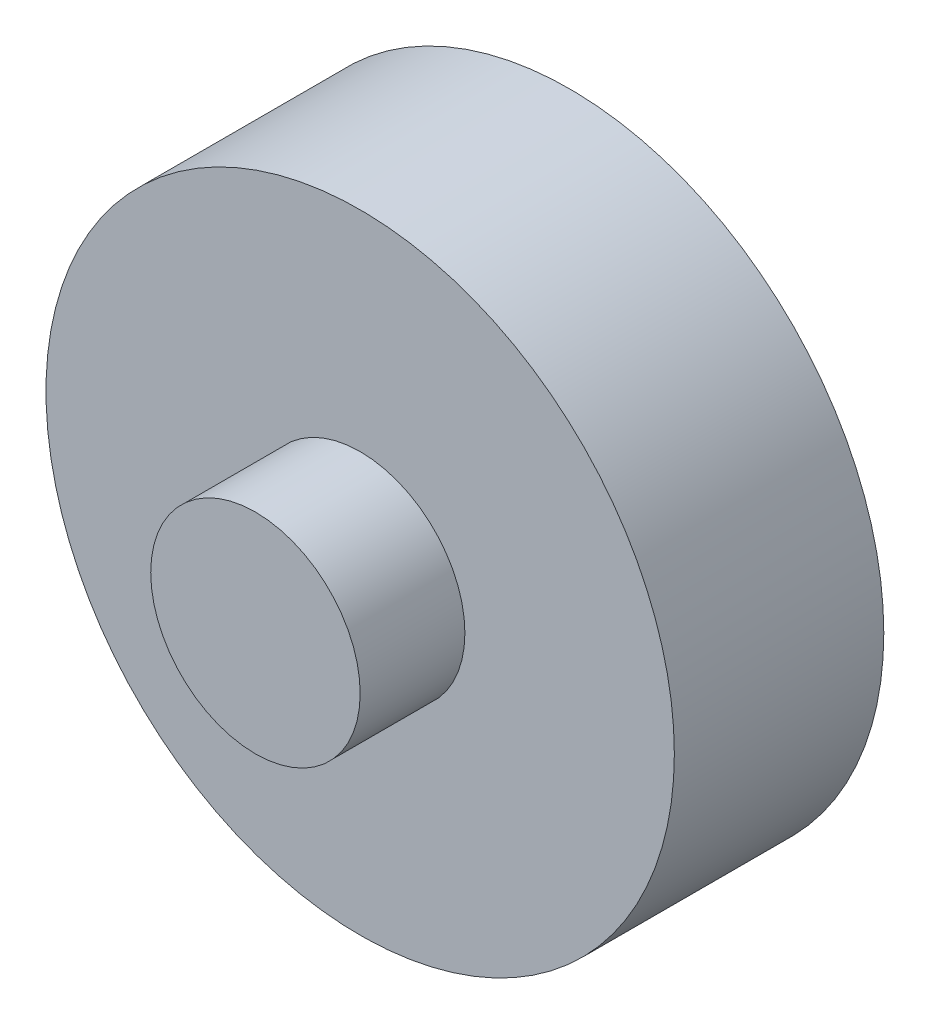
ISO-10303-21;
HEADER;
FILE_DESCRIPTION(('STEP AP214'),'2;1');
FILE_NAME('part.step','',(''),(''),'','','');
FILE_SCHEMA(('AUTOMOTIVE_DESIGN { 1 0 10303 214 1 1 1 1 }'));
ENDSEC;
DATA;
#1=APPLICATION_CONTEXT('core data for automotive mechanical design processes');
#2=APPLICATION_PROTOCOL_DEFINITION('international standard','automotive_design',2000,#1);
#3=PRODUCT_CONTEXT('',#1,'mechanical');
#4=PRODUCT('Part','Part','',(#3));
#5=PRODUCT_RELATED_PRODUCT_CATEGORY('part','',(#4));
#6=PRODUCT_DEFINITION_FORMATION('','',#4);
#7=PRODUCT_DEFINITION_CONTEXT('part definition',#1,'design');
#8=PRODUCT_DEFINITION('design','',#6,#7);
#9=PRODUCT_DEFINITION_SHAPE('','',#8);
#10=(LENGTH_UNIT() NAMED_UNIT(*) SI_UNIT(.MILLI.,.METRE.));
#11=(NAMED_UNIT(*) PLANE_ANGLE_UNIT() SI_UNIT($,.RADIAN.));
#12=(NAMED_UNIT(*) SI_UNIT($,.STERADIAN.) SOLID_ANGLE_UNIT());
#13=UNCERTAINTY_MEASURE_WITH_UNIT(LENGTH_MEASURE(1.E-05),#10,'distance_accuracy_value','');
#14=(GEOMETRIC_REPRESENTATION_CONTEXT(3) GLOBAL_UNCERTAINTY_ASSIGNED_CONTEXT((#13)) GLOBAL_UNIT_ASSIGNED_CONTEXT((#10,
#11,#12)) REPRESENTATION_CONTEXT('',''));
#15=CARTESIAN_POINT('',(0.,0.,0.));
#16=DIRECTION('',(0.,0.,1.));
#17=DIRECTION('',(1.,0.,0.));
#18=AXIS2_PLACEMENT_3D('',#15,#16,#17);
#19=CARTESIAN_POINT('',(0.,0.,2.5));
#20=DIRECTION('',(0.,0.,-1.));
#21=DIRECTION('',(-1.,0.,0.));
#22=AXIS2_PLACEMENT_3D('',#19,#20,#21);
#23=CYLINDRICAL_SURFACE('',#22,7.5);
#24=CARTESIAN_POINT('',(0.,0.,2.5));
#25=DIRECTION('',(0.,0.,1.));
#26=DIRECTION('',(1.,0.,0.));
#27=AXIS2_PLACEMENT_3D('',#24,#25,#26);
#28=CIRCLE('',#27,7.5);
#29=CARTESIAN_POINT('',(7.5,0.,2.5));
#30=VERTEX_POINT('',#29);
#31=EDGE_CURVE('E45',#30,#30,#28,.T.);
#32=ORIENTED_EDGE('',*,*,#31,.F.);
#33=EDGE_LOOP('',(#32));
#34=FACE_BOUND('',#33,.T.);
#35=CARTESIAN_POINT('',(0.,0.,-2.5));
#36=DIRECTION('',(0.,0.,1.));
#37=DIRECTION('',(1.,0.,0.));
#38=AXIS2_PLACEMENT_3D('',#35,#36,#37);
#39=CIRCLE('',#38,7.5);
#40=CARTESIAN_POINT('',(7.5,0.,-2.5));
#41=VERTEX_POINT('',#40);
#42=EDGE_CURVE('E51',#41,#41,#39,.T.);
#43=ORIENTED_EDGE('',*,*,#42,.T.);
#44=EDGE_LOOP('',(#43));
#45=FACE_BOUND('',#44,.T.);
#46=ADVANCED_FACE('F37',(#34,#45),#23,.T.);
#47=CARTESIAN_POINT('',(0.,0.,2.5));
#48=DIRECTION('',(0.,0.,1.));
#49=DIRECTION('',(1.,0.,0.));
#50=AXIS2_PLACEMENT_3D('',#47,#48,#49);
#51=PLANE('',#50);
#52=CARTESIAN_POINT('',(0.,0.,2.5));
#53=DIRECTION('',(0.,0.,1.));
#54=DIRECTION('',(1.,0.,0.));
#55=AXIS2_PLACEMENT_3D('',#52,#53,#54);
#56=CIRCLE('',#55,2.5);
#57=CARTESIAN_POINT('',(2.5,0.,2.5));
#58=VERTEX_POINT('',#57);
#59=EDGE_CURVE('E10',#58,#58,#56,.T.);
#60=ORIENTED_EDGE('',*,*,#59,.F.);
#61=EDGE_LOOP('',(#60));
#62=FACE_BOUND('',#61,.T.);
#63=ORIENTED_EDGE('',*,*,#31,.T.);
#64=EDGE_LOOP('',(#63));
#65=FACE_BOUND('',#64,.T.);
#66=ADVANCED_FACE('F88',(#62,#65),#51,.T.);
#67=CARTESIAN_POINT('',(0.,0.,-2.5));
#68=DIRECTION('',(0.,0.,1.));
#69=DIRECTION('',(1.,0.,0.));
#70=AXIS2_PLACEMENT_3D('',#67,#68,#69);
#71=PLANE('',#70);
#72=CARTESIAN_POINT('',(0.,0.,-2.5));
#73=DIRECTION('',(0.,0.,1.));
#74=DIRECTION('',(1.,0.,0.));
#75=AXIS2_PLACEMENT_3D('',#72,#73,#74);
#76=CIRCLE('',#75,2.5);
#77=CARTESIAN_POINT('',(2.5,0.,-2.5));
#78=VERTEX_POINT('',#77);
#79=EDGE_CURVE('E40',#78,#78,#76,.T.);
#80=ORIENTED_EDGE('',*,*,#79,.T.);
#81=EDGE_LOOP('',(#80));
#82=FACE_BOUND('',#81,.T.);
#83=ORIENTED_EDGE('',*,*,#42,.F.);
#84=EDGE_LOOP('',(#83));
#85=FACE_BOUND('',#84,.T.);
#86=ADVANCED_FACE('F93',(#82,#85),#71,.F.);
#87=CARTESIAN_POINT('',(0.,0.,-5.));
#88=DIRECTION('',(0.,0.,1.));
#89=DIRECTION('',(1.,0.,0.));
#90=AXIS2_PLACEMENT_3D('',#87,#88,#89);
#91=PLANE('',#90);
#92=CARTESIAN_POINT('',(0.,0.,-5.));
#93=DIRECTION('',(0.,0.,1.));
#94=DIRECTION('',(1.,0.,0.));
#95=AXIS2_PLACEMENT_3D('',#92,#93,#94);
#96=CIRCLE('',#95,2.5);
#97=CARTESIAN_POINT('',(2.5,0.,-5.));
#98=VERTEX_POINT('',#97);
#99=EDGE_CURVE('E54',#98,#98,#96,.T.);
#100=ORIENTED_EDGE('',*,*,#99,.F.);
#101=EDGE_LOOP('',(#100));
#102=FACE_BOUND('',#101,.T.);
#103=ADVANCED_FACE('F84',(#102),#91,.F.);
#104=CARTESIAN_POINT('',(0.,0.,-5.));
#105=DIRECTION('',(0.,0.,1.));
#106=DIRECTION('',(1.,0.,0.));
#107=AXIS2_PLACEMENT_3D('',#104,#105,#106);
#108=CYLINDRICAL_SURFACE('',#107,2.5);
#109=ORIENTED_EDGE('',*,*,#99,.T.);
#110=EDGE_LOOP('',(#109));
#111=FACE_BOUND('',#110,.T.);
#112=ORIENTED_EDGE('',*,*,#79,.F.);
#113=EDGE_LOOP('',(#112));
#114=FACE_BOUND('',#113,.T.);
#115=ADVANCED_FACE('F77',(#111,#114),#108,.T.);
#116=ORIENTED_EDGE('',*,*,#59,.T.);
#117=EDGE_LOOP('',(#116));
#118=FACE_BOUND('',#117,.T.);
#119=CARTESIAN_POINT('',(0.,0.,5.));
#120=DIRECTION('',(0.,0.,1.));
#121=DIRECTION('',(1.,0.,0.));
#122=AXIS2_PLACEMENT_3D('',#119,#120,#121);
#123=CIRCLE('',#122,2.5);
#124=CARTESIAN_POINT('',(2.5,0.,5.));
#125=VERTEX_POINT('',#124);
#126=EDGE_CURVE('E66',#125,#125,#123,.T.);
#127=ORIENTED_EDGE('',*,*,#126,.F.);
#128=EDGE_LOOP('',(#127));
#129=FACE_BOUND('',#128,.T.);
#130=ADVANCED_FACE('F75',(#118,#129),#108,.T.);
#131=CARTESIAN_POINT('',(0.,0.,5.));
#132=DIRECTION('',(0.,0.,1.));
#133=DIRECTION('',(1.,0.,0.));
#134=AXIS2_PLACEMENT_3D('',#131,#132,#133);
#135=PLANE('',#134);
#136=ORIENTED_EDGE('',*,*,#126,.T.);
#137=EDGE_LOOP('',(#136));
#138=FACE_BOUND('',#137,.T.);
#139=ADVANCED_FACE('F73',(#138),#135,.T.);
#140=CLOSED_SHELL('',(#46,#66,#86,#103,#115,#130,#139));
#141=MANIFOLD_SOLID_BREP('B2',#140);
#142=ADVANCED_BREP_SHAPE_REPRESENTATION('',(#18,#141),#14);
#143=SHAPE_DEFINITION_REPRESENTATION(#9,#142);
ENDSEC;
END-ISO-10303-21;
